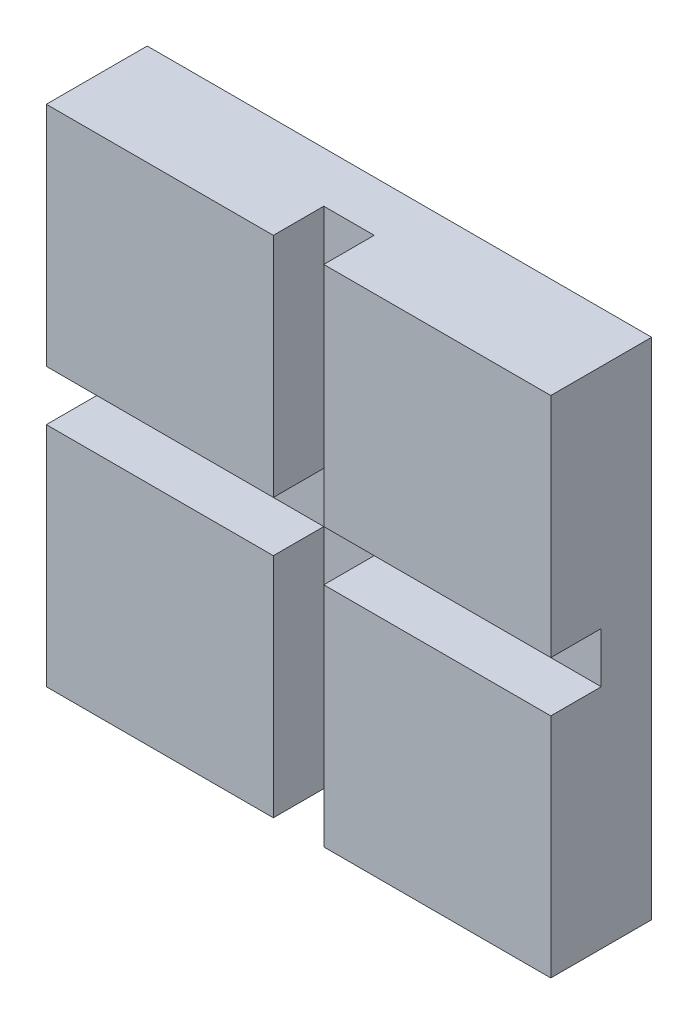
ISO-10303-21;
HEADER;
FILE_DESCRIPTION(('STEP AP214'),'2;1');
FILE_NAME('part.step','',(''),(''),'','','');
FILE_SCHEMA(('AUTOMOTIVE_DESIGN { 1 0 10303 214 1 1 1 1 }'));
ENDSEC;
DATA;
#1=APPLICATION_CONTEXT('core data for automotive mechanical design processes');
#2=APPLICATION_PROTOCOL_DEFINITION('international standard','automotive_design',2000,#1);
#3=PRODUCT_CONTEXT('',#1,'mechanical');
#4=PRODUCT('Part','Part','',(#3));
#5=PRODUCT_RELATED_PRODUCT_CATEGORY('part','',(#4));
#6=PRODUCT_DEFINITION_FORMATION('','',#4);
#7=PRODUCT_DEFINITION_CONTEXT('part definition',#1,'design');
#8=PRODUCT_DEFINITION('design','',#6,#7);
#9=PRODUCT_DEFINITION_SHAPE('','',#8);
#10=(LENGTH_UNIT() NAMED_UNIT(*) SI_UNIT(.MILLI.,.METRE.));
#11=(NAMED_UNIT(*) PLANE_ANGLE_UNIT() SI_UNIT($,.RADIAN.));
#12=(NAMED_UNIT(*) SI_UNIT($,.STERADIAN.) SOLID_ANGLE_UNIT());
#13=UNCERTAINTY_MEASURE_WITH_UNIT(LENGTH_MEASURE(1.E-05),#10,'distance_accuracy_value','');
#14=(GEOMETRIC_REPRESENTATION_CONTEXT(3) GLOBAL_UNCERTAINTY_ASSIGNED_CONTEXT((#13)) GLOBAL_UNIT_ASSIGNED_CONTEXT((#10,
#11,#12)) REPRESENTATION_CONTEXT('',''));
#15=CARTESIAN_POINT('',(0.,0.,0.));
#16=DIRECTION('',(0.,0.,1.));
#17=DIRECTION('',(1.,0.,0.));
#18=AXIS2_PLACEMENT_3D('',#15,#16,#17);
#19=CARTESIAN_POINT('',(-50.,50.,0.));
#20=DIRECTION('',(0.,0.,1.));
#21=DIRECTION('',(1.,0.,0.));
#22=AXIS2_PLACEMENT_3D('',#19,#20,#21);
#23=PLANE('',#22);
#24=DIRECTION('',(-1.,0.,0.));
#25=VECTOR('',#24,1.);
#26=CARTESIAN_POINT('',(50.,5.,0.));
#27=LINE('',#26,#25);
#28=CARTESIAN_POINT('',(-5.,5.,0.));
#29=VERTEX_POINT('',#28);
#30=CARTESIAN_POINT('',(-50.,5.,0.));
#31=VERTEX_POINT('',#30);
#32=EDGE_CURVE('E258',#29,#31,#27,.T.);
#33=ORIENTED_EDGE('',*,*,#32,.F.);
#34=DIRECTION('',(0.,1.,0.));
#35=VECTOR('',#34,1.);
#36=CARTESIAN_POINT('',(-5.,-50.,0.));
#37=LINE('',#36,#35);
#38=CARTESIAN_POINT('',(-5.,50.,0.));
#39=VERTEX_POINT('',#38);
#40=EDGE_CURVE('E204',#29,#39,#37,.T.);
#41=ORIENTED_EDGE('',*,*,#40,.T.);
#42=DIRECTION('',(-1.,0.,0.));
#43=VECTOR('',#42,1.);
#44=CARTESIAN_POINT('',(50.,50.,0.));
#45=LINE('',#44,#43);
#46=CARTESIAN_POINT('',(-50.,50.,0.));
#47=VERTEX_POINT('',#46);
#48=EDGE_CURVE('E241',#39,#47,#45,.T.);
#49=ORIENTED_EDGE('',*,*,#48,.T.);
#50=DIRECTION('',(0.,-1.,0.));
#51=VECTOR('',#50,1.);
#52=CARTESIAN_POINT('',(-50.,-50.,0.));
#53=LINE('',#52,#51);
#54=EDGE_CURVE('E230',#47,#31,#53,.T.);
#55=ORIENTED_EDGE('',*,*,#54,.T.);
#56=EDGE_LOOP('',(#33,#41,#49,#55));
#57=FACE_BOUND('',#56,.T.);
#58=ADVANCED_FACE('F31',(#57),#23,.T.);
#59=CARTESIAN_POINT('',(50.,5.,0.));
#60=VERTEX_POINT('',#59);
#61=CARTESIAN_POINT('',(5.,5.,0.));
#62=VERTEX_POINT('',#61);
#63=EDGE_CURVE('E163',#60,#62,#27,.T.);
#64=ORIENTED_EDGE('',*,*,#63,.F.);
#65=DIRECTION('',(0.,1.,0.));
#66=VECTOR('',#65,1.);
#67=CARTESIAN_POINT('',(50.,-50.,0.));
#68=LINE('',#67,#66);
#69=CARTESIAN_POINT('',(50.,50.,0.));
#70=VERTEX_POINT('',#69);
#71=EDGE_CURVE('E237',#60,#70,#68,.T.);
#72=ORIENTED_EDGE('',*,*,#71,.T.);
#73=CARTESIAN_POINT('',(5.,50.,0.));
#74=VERTEX_POINT('',#73);
#75=EDGE_CURVE('E221',#70,#74,#45,.T.);
#76=ORIENTED_EDGE('',*,*,#75,.T.);
#77=DIRECTION('',(0.,1.,0.));
#78=VECTOR('',#77,1.);
#79=CARTESIAN_POINT('',(5.,-50.,0.));
#80=LINE('',#79,#78);
#81=EDGE_CURVE('E186',#62,#74,#80,.T.);
#82=ORIENTED_EDGE('',*,*,#81,.F.);
#83=EDGE_LOOP('',(#64,#72,#76,#82));
#84=FACE_BOUND('',#83,.T.);
#85=ADVANCED_FACE('F273',(#84),#23,.T.);
#86=CARTESIAN_POINT('',(-5.,-50.,-10.));
#87=DIRECTION('',(1.,0.,0.));
#88=DIRECTION('',(0.,0.,-1.));
#89=AXIS2_PLACEMENT_3D('',#86,#87,#88);
#90=PLANE('',#89);
#91=DIRECTION('',(0.,0.,1.));
#92=VECTOR('',#91,1.);
#93=CARTESIAN_POINT('',(-5.,5.,-10.));
#94=LINE('',#93,#92);
#95=CARTESIAN_POINT('',(-5.,5.,-10.));
#96=VERTEX_POINT('',#95);
#97=EDGE_CURVE('E184',#96,#29,#94,.T.);
#98=ORIENTED_EDGE('',*,*,#97,.F.);
#99=DIRECTION('',(0.,1.,0.));
#100=VECTOR('',#99,1.);
#101=CARTESIAN_POINT('',(-5.,-50.,-10.));
#102=LINE('',#101,#100);
#103=CARTESIAN_POINT('',(-5.,50.,-10.));
#104=VERTEX_POINT('',#103);
#105=EDGE_CURVE('E197',#96,#104,#102,.T.);
#106=ORIENTED_EDGE('',*,*,#105,.T.);
#107=DIRECTION('',(0.,0.,1.));
#108=VECTOR('',#107,1.);
#109=CARTESIAN_POINT('',(-5.,50.,-10.));
#110=LINE('',#109,#108);
#111=EDGE_CURVE('E210',#104,#39,#110,.T.);
#112=ORIENTED_EDGE('',*,*,#111,.T.);
#113=ORIENTED_EDGE('',*,*,#40,.F.);
#114=EDGE_LOOP('',(#98,#106,#112,#113));
#115=FACE_BOUND('',#114,.T.);
#116=ADVANCED_FACE('F290',(#115),#90,.T.);
#117=CARTESIAN_POINT('',(5.,-50.,-10.));
#118=DIRECTION('',(1.,0.,0.));
#119=DIRECTION('',(0.,0.,-1.));
#120=AXIS2_PLACEMENT_3D('',#117,#118,#119);
#121=PLANE('',#120);
#122=DIRECTION('',(0.,1.,0.));
#123=VECTOR('',#122,1.);
#124=CARTESIAN_POINT('',(5.,-50.,-10.));
#125=LINE('',#124,#123);
#126=CARTESIAN_POINT('',(5.,5.,-10.));
#127=VERTEX_POINT('',#126);
#128=CARTESIAN_POINT('',(5.,50.,-10.));
#129=VERTEX_POINT('',#128);
#130=EDGE_CURVE('E190',#127,#129,#125,.T.);
#131=ORIENTED_EDGE('',*,*,#130,.F.);
#132=DIRECTION('',(0.,0.,1.));
#133=VECTOR('',#132,1.);
#134=CARTESIAN_POINT('',(5.,5.,-10.));
#135=LINE('',#134,#133);
#136=EDGE_CURVE('E181',#127,#62,#135,.T.);
#137=ORIENTED_EDGE('',*,*,#136,.T.);
#138=ORIENTED_EDGE('',*,*,#81,.T.);
#139=DIRECTION('',(0.,0.,1.));
#140=VECTOR('',#139,1.);
#141=CARTESIAN_POINT('',(5.,50.,-10.));
#142=LINE('',#141,#140);
#143=EDGE_CURVE('E213',#129,#74,#142,.T.);
#144=ORIENTED_EDGE('',*,*,#143,.F.);
#145=EDGE_LOOP('',(#131,#137,#138,#144));
#146=FACE_BOUND('',#145,.T.);
#147=ADVANCED_FACE('F286',(#146),#121,.F.);
#148=CARTESIAN_POINT('',(50.,50.,-20.));
#149=DIRECTION('',(0.,1.,0.));
#150=DIRECTION('',(-1.,0.,0.));
#151=AXIS2_PLACEMENT_3D('',#148,#149,#150);
#152=PLANE('',#151);
#153=ORIENTED_EDGE('',*,*,#48,.F.);
#154=ORIENTED_EDGE('',*,*,#111,.F.);
#155=DIRECTION('',(1.,0.,0.));
#156=VECTOR('',#155,1.);
#157=CARTESIAN_POINT('',(-5.,50.,-10.));
#158=LINE('',#157,#156);
#159=EDGE_CURVE('E194',#104,#129,#158,.T.);
#160=ORIENTED_EDGE('',*,*,#159,.T.);
#161=ORIENTED_EDGE('',*,*,#143,.T.);
#162=ORIENTED_EDGE('',*,*,#75,.F.);
#163=DIRECTION('',(0.,0.,1.));
#164=VECTOR('',#163,1.);
#165=CARTESIAN_POINT('',(50.,50.,-20.));
#166=LINE('',#165,#164);
#167=CARTESIAN_POINT('',(50.,50.,-20.));
#168=VERTEX_POINT('',#167);
#169=EDGE_CURVE('E40',#168,#70,#166,.T.);
#170=ORIENTED_EDGE('',*,*,#169,.F.);
#171=DIRECTION('',(-1.,0.,0.));
#172=VECTOR('',#171,1.);
#173=CARTESIAN_POINT('',(50.,50.,-20.));
#174=LINE('',#173,#172);
#175=CARTESIAN_POINT('',(-50.,50.,-20.));
#176=VERTEX_POINT('',#175);
#177=EDGE_CURVE('E227',#168,#176,#174,.T.);
#178=ORIENTED_EDGE('',*,*,#177,.T.);
#179=DIRECTION('',(0.,0.,1.));
#180=VECTOR('',#179,1.);
#181=CARTESIAN_POINT('',(-50.,50.,-20.));
#182=LINE('',#181,#180);
#183=EDGE_CURVE('E11',#176,#47,#182,.T.);
#184=ORIENTED_EDGE('',*,*,#183,.T.);
#185=EDGE_LOOP('',(#153,#154,#160,#161,#162,#170,#178,#184));
#186=FACE_BOUND('',#185,.T.);
#187=ADVANCED_FACE('F280',(#186),#152,.T.);
#188=CARTESIAN_POINT('',(50.,-50.,-20.));
#189=DIRECTION('',(0.,-1.,0.));
#190=DIRECTION('',(1.,0.,0.));
#191=AXIS2_PLACEMENT_3D('',#188,#189,#190);
#192=PLANE('',#191);
#193=DIRECTION('',(1.,0.,0.));
#194=VECTOR('',#193,1.);
#195=CARTESIAN_POINT('',(-5.,-50.,-10.));
#196=LINE('',#195,#194);
#197=CARTESIAN_POINT('',(-5.,-50.,-10.));
#198=VERTEX_POINT('',#197);
#199=CARTESIAN_POINT('',(5.,-50.,-10.));
#200=VERTEX_POINT('',#199);
#201=EDGE_CURVE('E187',#198,#200,#196,.T.);
#202=ORIENTED_EDGE('',*,*,#201,.F.);
#203=DIRECTION('',(0.,0.,1.));
#204=VECTOR('',#203,1.);
#205=CARTESIAN_POINT('',(-5.,-50.,-10.));
#206=LINE('',#205,#204);
#207=CARTESIAN_POINT('',(-5.,-50.,0.));
#208=VERTEX_POINT('',#207);
#209=EDGE_CURVE('E207',#198,#208,#206,.T.);
#210=ORIENTED_EDGE('',*,*,#209,.T.);
#211=DIRECTION('',(1.,0.,0.));
#212=VECTOR('',#211,1.);
#213=CARTESIAN_POINT('',(50.,-50.,0.));
#214=LINE('',#213,#212);
#215=CARTESIAN_POINT('',(-50.,-50.,0.));
#216=VERTEX_POINT('',#215);
#217=EDGE_CURVE('E234',#216,#208,#214,.T.);
#218=ORIENTED_EDGE('',*,*,#217,.F.);
#219=DIRECTION('',(0.,0.,1.));
#220=VECTOR('',#219,1.);
#221=CARTESIAN_POINT('',(-50.,-50.,-20.));
#222=LINE('',#221,#220);
#223=CARTESIAN_POINT('',(-50.,-50.,-20.));
#224=VERTEX_POINT('',#223);
#225=EDGE_CURVE('E35',#224,#216,#222,.T.);
#226=ORIENTED_EDGE('',*,*,#225,.F.);
#227=DIRECTION('',(1.,0.,0.));
#228=VECTOR('',#227,1.);
#229=CARTESIAN_POINT('',(50.,-50.,-20.));
#230=LINE('',#229,#228);
#231=CARTESIAN_POINT('',(50.,-50.,-20.));
#232=VERTEX_POINT('',#231);
#233=EDGE_CURVE('E220',#224,#232,#230,.T.);
#234=ORIENTED_EDGE('',*,*,#233,.T.);
#235=DIRECTION('',(0.,0.,1.));
#236=VECTOR('',#235,1.);
#237=CARTESIAN_POINT('',(50.,-50.,-20.));
#238=LINE('',#237,#236);
#239=CARTESIAN_POINT('',(50.,-50.,0.));
#240=VERTEX_POINT('',#239);
#241=EDGE_CURVE('E245',#232,#240,#238,.T.);
#242=ORIENTED_EDGE('',*,*,#241,.T.);
#243=CARTESIAN_POINT('',(5.,-50.,0.));
#244=VERTEX_POINT('',#243);
#245=EDGE_CURVE('E233',#244,#240,#214,.T.);
#246=ORIENTED_EDGE('',*,*,#245,.F.);
#247=DIRECTION('',(0.,0.,1.));
#248=VECTOR('',#247,1.);
#249=CARTESIAN_POINT('',(5.,-50.,-10.));
#250=LINE('',#249,#248);
#251=EDGE_CURVE('E200',#200,#244,#250,.T.);
#252=ORIENTED_EDGE('',*,*,#251,.F.);
#253=EDGE_LOOP('',(#202,#210,#218,#226,#234,#242,#246,#252));
#254=FACE_BOUND('',#253,.T.);
#255=ADVANCED_FACE('F254',(#254),#192,.T.);
#256=DIRECTION('',(1.,0.,0.));
#257=VECTOR('',#256,1.);
#258=CARTESIAN_POINT('',(50.,-5.,0.));
#259=LINE('',#258,#257);
#260=CARTESIAN_POINT('',(-50.,-5.,0.));
#261=VERTEX_POINT('',#260);
#262=CARTESIAN_POINT('',(-5.,-5.,0.));
#263=VERTEX_POINT('',#262);
#264=EDGE_CURVE('E257',#261,#263,#259,.T.);
#265=ORIENTED_EDGE('',*,*,#264,.F.);
#266=EDGE_CURVE('E167',#261,#216,#53,.T.);
#267=ORIENTED_EDGE('',*,*,#266,.T.);
#268=ORIENTED_EDGE('',*,*,#217,.T.);
#269=EDGE_CURVE('E191',#208,#263,#37,.T.);
#270=ORIENTED_EDGE('',*,*,#269,.T.);
#271=EDGE_LOOP('',(#265,#267,#268,#270));
#272=FACE_BOUND('',#271,.T.);
#273=ADVANCED_FACE('F256',(#272),#23,.T.);
#274=CARTESIAN_POINT('',(-50.,-50.,-20.));
#275=DIRECTION('',(-1.,0.,0.));
#276=DIRECTION('',(0.,0.,1.));
#277=AXIS2_PLACEMENT_3D('',#274,#275,#276);
#278=PLANE('',#277);
#279=DIRECTION('',(0.,0.,1.));
#280=VECTOR('',#279,1.);
#281=CARTESIAN_POINT('',(-50.,5.,-10.));
#282=LINE('',#281,#280);
#283=CARTESIAN_POINT('',(-50.,5.,-10.));
#284=VERTEX_POINT('',#283);
#285=EDGE_CURVE('E179',#284,#31,#282,.T.);
#286=ORIENTED_EDGE('',*,*,#285,.T.);
#287=ORIENTED_EDGE('',*,*,#54,.F.);
#288=ORIENTED_EDGE('',*,*,#183,.F.);
#289=DIRECTION('',(0.,-1.,0.));
#290=VECTOR('',#289,1.);
#291=CARTESIAN_POINT('',(-50.,-50.,-20.));
#292=LINE('',#291,#290);
#293=EDGE_CURVE('E217',#176,#224,#292,.T.);
#294=ORIENTED_EDGE('',*,*,#293,.T.);
#295=ORIENTED_EDGE('',*,*,#225,.T.);
#296=ORIENTED_EDGE('',*,*,#266,.F.);
#297=DIRECTION('',(0.,0.,1.));
#298=VECTOR('',#297,1.);
#299=CARTESIAN_POINT('',(-50.,-5.,-10.));
#300=LINE('',#299,#298);
#301=CARTESIAN_POINT('',(-50.,-5.,-10.));
#302=VERTEX_POINT('',#301);
#303=EDGE_CURVE('E146',#302,#261,#300,.T.);
#304=ORIENTED_EDGE('',*,*,#303,.F.);
#305=DIRECTION('',(0.,-1.,0.));
#306=VECTOR('',#305,1.);
#307=CARTESIAN_POINT('',(-50.,-5.,-10.));
#308=LINE('',#307,#306);
#309=EDGE_CURVE('E155',#284,#302,#308,.T.);
#310=ORIENTED_EDGE('',*,*,#309,.F.);
#311=EDGE_LOOP('',(#286,#287,#288,#294,#295,#296,#304,#310));
#312=FACE_BOUND('',#311,.T.);
#313=ADVANCED_FACE('F33',(#312),#278,.T.);
#314=CARTESIAN_POINT('',(50.,-50.,-20.));
#315=DIRECTION('',(1.,0.,0.));
#316=DIRECTION('',(0.,0.,-1.));
#317=AXIS2_PLACEMENT_3D('',#314,#315,#316);
#318=PLANE('',#317);
#319=DIRECTION('',(0.,0.,1.));
#320=VECTOR('',#319,1.);
#321=CARTESIAN_POINT('',(50.,5.,-10.));
#322=LINE('',#321,#320);
#323=CARTESIAN_POINT('',(50.,5.,-10.));
#324=VERTEX_POINT('',#323);
#325=EDGE_CURVE('E171',#324,#60,#322,.T.);
#326=ORIENTED_EDGE('',*,*,#325,.F.);
#327=DIRECTION('',(0.,1.,0.));
#328=VECTOR('',#327,1.);
#329=CARTESIAN_POINT('',(50.,-5.,-10.));
#330=LINE('',#329,#328);
#331=CARTESIAN_POINT('',(50.,-5.,-10.));
#332=VERTEX_POINT('',#331);
#333=EDGE_CURVE('E151',#332,#324,#330,.T.);
#334=ORIENTED_EDGE('',*,*,#333,.F.);
#335=DIRECTION('',(0.,0.,1.));
#336=VECTOR('',#335,1.);
#337=CARTESIAN_POINT('',(50.,-5.,-10.));
#338=LINE('',#337,#336);
#339=CARTESIAN_POINT('',(50.,-5.,0.));
#340=VERTEX_POINT('',#339);
#341=EDGE_CURVE('E168',#332,#340,#338,.T.);
#342=ORIENTED_EDGE('',*,*,#341,.T.);
#343=EDGE_CURVE('E238',#240,#340,#68,.T.);
#344=ORIENTED_EDGE('',*,*,#343,.F.);
#345=ORIENTED_EDGE('',*,*,#241,.F.);
#346=DIRECTION('',(0.,1.,0.));
#347=VECTOR('',#346,1.);
#348=CARTESIAN_POINT('',(50.,-50.,-20.));
#349=LINE('',#348,#347);
#350=EDGE_CURVE('E224',#232,#168,#349,.T.);
#351=ORIENTED_EDGE('',*,*,#350,.T.);
#352=ORIENTED_EDGE('',*,*,#169,.T.);
#353=ORIENTED_EDGE('',*,*,#71,.F.);
#354=EDGE_LOOP('',(#326,#334,#342,#344,#345,#351,#352,#353));
#355=FACE_BOUND('',#354,.T.);
#356=ADVANCED_FACE('F274',(#355),#318,.T.);
#357=CARTESIAN_POINT('',(-50.,50.,-20.));
#358=DIRECTION('',(0.,0.,1.));
#359=DIRECTION('',(1.,0.,0.));
#360=AXIS2_PLACEMENT_3D('',#357,#358,#359);
#361=PLANE('',#360);
#362=ORIENTED_EDGE('',*,*,#293,.F.);
#363=ORIENTED_EDGE('',*,*,#177,.F.);
#364=ORIENTED_EDGE('',*,*,#350,.F.);
#365=ORIENTED_EDGE('',*,*,#233,.F.);
#366=EDGE_LOOP('',(#362,#363,#364,#365));
#367=FACE_BOUND('',#366,.T.);
#368=ADVANCED_FACE('F297',(#367),#361,.F.);
#369=CARTESIAN_POINT('',(5.,-5.,0.));
#370=VERTEX_POINT('',#369);
#371=EDGE_CURVE('E259',#370,#340,#259,.T.);
#372=ORIENTED_EDGE('',*,*,#371,.F.);
#373=EDGE_CURVE('E201',#244,#370,#80,.T.);
#374=ORIENTED_EDGE('',*,*,#373,.F.);
#375=ORIENTED_EDGE('',*,*,#245,.T.);
#376=ORIENTED_EDGE('',*,*,#343,.T.);
#377=EDGE_LOOP('',(#372,#374,#375,#376));
#378=FACE_BOUND('',#377,.T.);
#379=ADVANCED_FACE('F299',(#378),#23,.T.);
#380=DIRECTION('',(0.,0.,-1.));
#381=VECTOR('',#380,1.);
#382=CARTESIAN_POINT('',(-5.,-5.,-10.));
#383=LINE('',#382,#381);
#384=CARTESIAN_POINT('',(-5.,-5.,-10.));
#385=VERTEX_POINT('',#384);
#386=EDGE_CURVE('E149',#263,#385,#383,.T.);
#387=ORIENTED_EDGE('',*,*,#386,.F.);
#388=ORIENTED_EDGE('',*,*,#269,.F.);
#389=ORIENTED_EDGE('',*,*,#209,.F.);
#390=EDGE_CURVE('E198',#198,#385,#102,.T.);
#391=ORIENTED_EDGE('',*,*,#390,.T.);
#392=EDGE_LOOP('',(#387,#388,#389,#391));
#393=FACE_BOUND('',#392,.T.);
#394=ADVANCED_FACE('F305',(#393),#90,.T.);
#395=ORIENTED_EDGE('',*,*,#373,.T.);
#396=DIRECTION('',(0.,0.,-1.));
#397=VECTOR('',#396,1.);
#398=CARTESIAN_POINT('',(5.,-5.,-10.));
#399=LINE('',#398,#397);
#400=CARTESIAN_POINT('',(5.,-5.,-10.));
#401=VERTEX_POINT('',#400);
#402=EDGE_CURVE('E176',#370,#401,#399,.T.);
#403=ORIENTED_EDGE('',*,*,#402,.T.);
#404=EDGE_CURVE('E192',#200,#401,#125,.T.);
#405=ORIENTED_EDGE('',*,*,#404,.F.);
#406=ORIENTED_EDGE('',*,*,#251,.T.);
#407=EDGE_LOOP('',(#395,#403,#405,#406));
#408=FACE_BOUND('',#407,.T.);
#409=ADVANCED_FACE('F346',(#408),#121,.F.);
#410=CARTESIAN_POINT('',(5.,-50.,-10.));
#411=DIRECTION('',(0.,0.,1.));
#412=DIRECTION('',(1.,0.,0.));
#413=AXIS2_PLACEMENT_3D('',#410,#411,#412);
#414=PLANE('',#413);
#415=ORIENTED_EDGE('',*,*,#404,.T.);
#416=DIRECTION('',(1.,0.,0.));
#417=VECTOR('',#416,1.);
#418=CARTESIAN_POINT('',(50.,-5.,-10.));
#419=LINE('',#418,#417);
#420=EDGE_CURVE('E152',#401,#332,#419,.T.);
#421=ORIENTED_EDGE('',*,*,#420,.T.);
#422=ORIENTED_EDGE('',*,*,#333,.T.);
#423=DIRECTION('',(-1.,0.,0.));
#424=VECTOR('',#423,1.);
#425=CARTESIAN_POINT('',(50.,5.,-10.));
#426=LINE('',#425,#424);
#427=EDGE_CURVE('E55',#324,#127,#426,.T.);
#428=ORIENTED_EDGE('',*,*,#427,.T.);
#429=ORIENTED_EDGE('',*,*,#130,.T.);
#430=ORIENTED_EDGE('',*,*,#159,.F.);
#431=ORIENTED_EDGE('',*,*,#105,.F.);
#432=EDGE_CURVE('E159',#96,#284,#426,.T.);
#433=ORIENTED_EDGE('',*,*,#432,.T.);
#434=ORIENTED_EDGE('',*,*,#309,.T.);
#435=EDGE_CURVE('E48',#302,#385,#419,.T.);
#436=ORIENTED_EDGE('',*,*,#435,.T.);
#437=ORIENTED_EDGE('',*,*,#390,.F.);
#438=ORIENTED_EDGE('',*,*,#201,.T.);
#439=EDGE_LOOP('',(#415,#421,#422,#428,#429,#430,#431,#433,#434,#436,#437,#438));
#440=FACE_BOUND('',#439,.T.);
#441=ADVANCED_FACE('F157',(#440),#414,.T.);
#442=CARTESIAN_POINT('',(50.,-5.,-10.));
#443=DIRECTION('',(0.,-1.,0.));
#444=DIRECTION('',(0.,0.,-1.));
#445=AXIS2_PLACEMENT_3D('',#442,#443,#444);
#446=PLANE('',#445);
#447=ORIENTED_EDGE('',*,*,#371,.T.);
#448=ORIENTED_EDGE('',*,*,#341,.F.);
#449=ORIENTED_EDGE('',*,*,#420,.F.);
#450=ORIENTED_EDGE('',*,*,#402,.F.);
#451=EDGE_LOOP('',(#447,#448,#449,#450));
#452=FACE_BOUND('',#451,.T.);
#453=ADVANCED_FACE('F366',(#452),#446,.F.);
#454=CARTESIAN_POINT('',(50.,5.,-10.));
#455=DIRECTION('',(0.,1.,0.));
#456=DIRECTION('',(0.,0.,1.));
#457=AXIS2_PLACEMENT_3D('',#454,#455,#456);
#458=PLANE('',#457);
#459=ORIENTED_EDGE('',*,*,#427,.F.);
#460=ORIENTED_EDGE('',*,*,#325,.T.);
#461=ORIENTED_EDGE('',*,*,#63,.T.);
#462=ORIENTED_EDGE('',*,*,#136,.F.);
#463=EDGE_LOOP('',(#459,#460,#461,#462));
#464=FACE_BOUND('',#463,.T.);
#465=ADVANCED_FACE('F267',(#464),#458,.F.);
#466=ORIENTED_EDGE('',*,*,#97,.T.);
#467=ORIENTED_EDGE('',*,*,#32,.T.);
#468=ORIENTED_EDGE('',*,*,#285,.F.);
#469=ORIENTED_EDGE('',*,*,#432,.F.);
#470=EDGE_LOOP('',(#466,#467,#468,#469));
#471=FACE_BOUND('',#470,.T.);
#472=ADVANCED_FACE('F293',(#471),#458,.F.);
#473=ORIENTED_EDGE('',*,*,#386,.T.);
#474=ORIENTED_EDGE('',*,*,#435,.F.);
#475=ORIENTED_EDGE('',*,*,#303,.T.);
#476=ORIENTED_EDGE('',*,*,#264,.T.);
#477=EDGE_LOOP('',(#473,#474,#475,#476));
#478=FACE_BOUND('',#477,.T.);
#479=ADVANCED_FACE('F144',(#478),#446,.F.);
#480=CLOSED_SHELL('',(#58,#85,#116,#147,#187,#255,#273,#313,#356,#368,#379,#394,#409,#441,#453,
#465,#472,#479));
#481=MANIFOLD_SOLID_BREP('B2',#480);
#482=ADVANCED_BREP_SHAPE_REPRESENTATION('',(#18,#481),#14);
#483=SHAPE_DEFINITION_REPRESENTATION(#9,#482);
ENDSEC;
END-ISO-10303-21;
